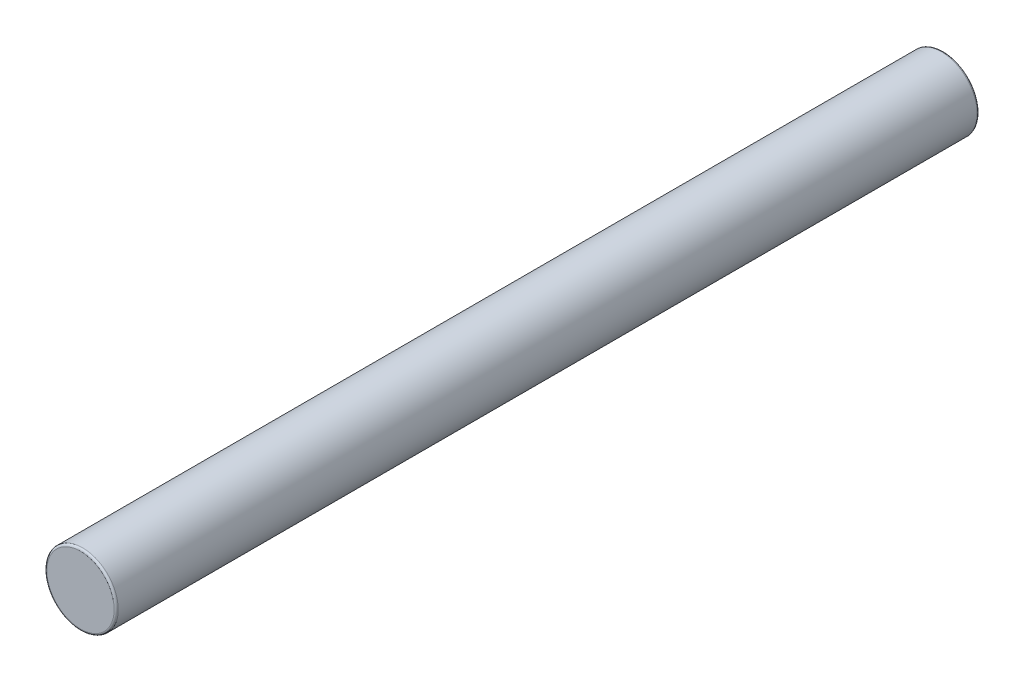
ISO-10303-21;
HEADER;
FILE_DESCRIPTION(('STEP AP214'),'2;1');
FILE_NAME('part.step','',(''),(''),'','','');
FILE_SCHEMA(('AUTOMOTIVE_DESIGN { 1 0 10303 214 1 1 1 1 }'));
ENDSEC;
DATA;
#1=APPLICATION_CONTEXT('core data for automotive mechanical design processes');
#2=APPLICATION_PROTOCOL_DEFINITION('international standard','automotive_design',2000,#1);
#3=PRODUCT_CONTEXT('',#1,'mechanical');
#4=PRODUCT('Part','Part','',(#3));
#5=PRODUCT_RELATED_PRODUCT_CATEGORY('part','',(#4));
#6=PRODUCT_DEFINITION_FORMATION('','',#4);
#7=PRODUCT_DEFINITION_CONTEXT('part definition',#1,'design');
#8=PRODUCT_DEFINITION('design','',#6,#7);
#9=PRODUCT_DEFINITION_SHAPE('','',#8);
#10=(LENGTH_UNIT() NAMED_UNIT(*) SI_UNIT(.MILLI.,.METRE.));
#11=(NAMED_UNIT(*) PLANE_ANGLE_UNIT() SI_UNIT($,.RADIAN.));
#12=(NAMED_UNIT(*) SI_UNIT($,.STERADIAN.) SOLID_ANGLE_UNIT());
#13=UNCERTAINTY_MEASURE_WITH_UNIT(LENGTH_MEASURE(1.E-05),#10,'distance_accuracy_value','');
#14=(GEOMETRIC_REPRESENTATION_CONTEXT(3) GLOBAL_UNCERTAINTY_ASSIGNED_CONTEXT((#13)) GLOBAL_UNIT_ASSIGNED_CONTEXT((#10,
#11,#12)) REPRESENTATION_CONTEXT('',''));
#15=CARTESIAN_POINT('',(0.,0.,0.));
#16=DIRECTION('',(0.,0.,1.));
#17=DIRECTION('',(1.,0.,0.));
#18=AXIS2_PLACEMENT_3D('',#15,#16,#17);
#19=CARTESIAN_POINT('',(0.,0.,42.));
#20=DIRECTION('',(0.,0.,-1.));
#21=DIRECTION('',(-1.,0.,0.));
#22=AXIS2_PLACEMENT_3D('',#19,#20,#21);
#23=CYLINDRICAL_SURFACE('',#22,3.475);
#24=CARTESIAN_POINT('',(0.,0.,41.8));
#25=DIRECTION('',(0.,0.,1.));
#26=DIRECTION('',(1.,0.,0.));
#27=AXIS2_PLACEMENT_3D('',#24,#25,#26);
#28=CIRCLE('',#27,3.475);
#29=CARTESIAN_POINT('',(-3.475,0.,41.8));
#30=VERTEX_POINT('',#29);
#31=EDGE_CURVE('E49',#30,#30,#28,.F.);
#32=CARTESIAN_POINT('',(0.,0.,-41.8));
#33=DIRECTION('',(0.,0.,1.));
#34=DIRECTION('',(1.,0.,0.));
#35=AXIS2_PLACEMENT_3D('',#32,#33,#34);
#36=CIRCLE('',#35,3.475);
#37=CARTESIAN_POINT('',(-3.475,0.,-41.8));
#38=VERTEX_POINT('',#37);
#39=EDGE_CURVE('E54',#38,#38,#36,.T.);
#40=CARTESIAN_POINT('',(-3.475,0.,41.8));
#41=CARTESIAN_POINT('',(-3.475,0.,40.9291666666667));
#42=CARTESIAN_POINT('',(-3.475,0.,40.0583333333333));
#43=CARTESIAN_POINT('',(-3.475,0.,38.3166666666667));
#44=CARTESIAN_POINT('',(-3.475,0.,37.4458333333333));
#45=CARTESIAN_POINT('',(-3.475,0.,35.7041666666667));
#46=CARTESIAN_POINT('',(-3.475,0.,34.8333333333333));
#47=CARTESIAN_POINT('',(-3.475,0.,33.0916666666667));
#48=CARTESIAN_POINT('',(-3.475,0.,32.2208333333333));
#49=CARTESIAN_POINT('',(-3.475,0.,30.4791666666667));
#50=CARTESIAN_POINT('',(-3.475,0.,29.6083333333333));
#51=CARTESIAN_POINT('',(-3.475,0.,27.8666666666667));
#52=CARTESIAN_POINT('',(-3.475,0.,26.9958333333333));
#53=CARTESIAN_POINT('',(-3.475,0.,25.2541666666667));
#54=CARTESIAN_POINT('',(-3.475,0.,24.3833333333333));
#55=CARTESIAN_POINT('',(-3.475,0.,22.6416666666667));
#56=CARTESIAN_POINT('',(-3.475,0.,21.7708333333333));
#57=CARTESIAN_POINT('',(-3.475,0.,20.0291666666667));
#58=CARTESIAN_POINT('',(-3.475,0.,19.1583333333333));
#59=CARTESIAN_POINT('',(-3.475,0.,17.4166666666667));
#60=CARTESIAN_POINT('',(-3.475,0.,16.5458333333333));
#61=CARTESIAN_POINT('',(-3.475,0.,14.8041666666667));
#62=CARTESIAN_POINT('',(-3.475,0.,13.9333333333333));
#63=CARTESIAN_POINT('',(-3.475,0.,12.1916666666667));
#64=CARTESIAN_POINT('',(-3.475,0.,11.3208333333333));
#65=CARTESIAN_POINT('',(-3.475,0.,9.57916666666666));
#66=CARTESIAN_POINT('',(-3.475,0.,8.70833333333332));
#67=CARTESIAN_POINT('',(-3.475,0.,6.96666666666666));
#68=CARTESIAN_POINT('',(-3.475,0.,6.09583333333332));
#69=CARTESIAN_POINT('',(-3.475,0.,4.35416666666665));
#70=CARTESIAN_POINT('',(-3.475,0.,3.48333333333332));
#71=CARTESIAN_POINT('',(-3.475,0.,1.74166666666666));
#72=CARTESIAN_POINT('',(-3.475,0.,0.870833333333321));
#73=CARTESIAN_POINT('',(-3.475,0.,-0.870833333333348));
#74=CARTESIAN_POINT('',(-3.475,0.,-1.74166666666668));
#75=CARTESIAN_POINT('',(-3.475,0.,-3.48333333333335));
#76=CARTESIAN_POINT('',(-3.475,0.,-4.35416666666668));
#77=CARTESIAN_POINT('',(-3.475,0.,-6.09583333333335));
#78=CARTESIAN_POINT('',(-3.475,0.,-6.96666666666668));
#79=CARTESIAN_POINT('',(-3.475,0.,-8.70833333333335));
#80=CARTESIAN_POINT('',(-3.475,0.,-9.57916666666668));
#81=CARTESIAN_POINT('',(-3.475,0.,-11.3208333333333));
#82=CARTESIAN_POINT('',(-3.475,0.,-12.1916666666667));
#83=CARTESIAN_POINT('',(-3.475,0.,-13.9333333333334));
#84=CARTESIAN_POINT('',(-3.475,0.,-14.8041666666667));
#85=CARTESIAN_POINT('',(-3.475,0.,-16.5458333333334));
#86=CARTESIAN_POINT('',(-3.475,0.,-17.4166666666667));
#87=CARTESIAN_POINT('',(-3.475,0.,-19.1583333333334));
#88=CARTESIAN_POINT('',(-3.475,0.,-20.0291666666667));
#89=CARTESIAN_POINT('',(-3.475,0.,-21.7708333333334));
#90=CARTESIAN_POINT('',(-3.475,0.,-22.6416666666667));
#91=CARTESIAN_POINT('',(-3.475,0.,-24.3833333333333));
#92=CARTESIAN_POINT('',(-3.475,0.,-25.2541666666667));
#93=CARTESIAN_POINT('',(-3.475,0.,-26.9958333333334));
#94=CARTESIAN_POINT('',(-3.475,0.,-27.8666666666667));
#95=CARTESIAN_POINT('',(-3.475,0.,-29.6083333333334));
#96=CARTESIAN_POINT('',(-3.475,0.,-30.4791666666667));
#97=CARTESIAN_POINT('',(-3.475,0.,-32.2208333333334));
#98=CARTESIAN_POINT('',(-3.475,0.,-33.0916666666667));
#99=CARTESIAN_POINT('',(-3.475,0.,-34.8333333333334));
#100=CARTESIAN_POINT('',(-3.475,0.,-35.7041666666667));
#101=CARTESIAN_POINT('',(-3.475,0.,-37.4458333333334));
#102=CARTESIAN_POINT('',(-3.475,0.,-38.3166666666667));
#103=CARTESIAN_POINT('',(-3.475,0.,-40.0583333333334));
#104=CARTESIAN_POINT('',(-3.475,0.,-40.9291666666667));
#105=CARTESIAN_POINT('',(-3.475,0.,-41.8));
#106=B_SPLINE_CURVE_WITH_KNOTS('',3,(#40,#41,#42,#43,#44,#45,#46,#47,#48,#49,#50,#51,#52,#53,
#54,#55,#56,#57,#58,#59,#60,#61,#62,#63,#64,#65,#66,#67,#68,#69,#70,#71,#72,#73,#74,#75,#76,#77,
#78,#79,#80,#81,#82,#83,#84,#85,#86,#87,#88,#89,#90,#91,#92,#93,#94,#95,#96,#97,#98,#99,#100,
#101,#102,#103,#104,#105),.UNSPECIFIED.,.F.,.F.,(4,2,2,2,2,2,2,2,2,2,2,2,2,2,2,2,2,2,2,2,2,2,2,
2,2,2,2,2,2,2,2,2,4),(0.,2.6125,5.225,7.8375,10.45,13.0625,15.675,18.2875,20.9,23.5125,26.125,
28.7375,31.35,33.9625,36.575,39.1875,41.8,44.4125,47.025,49.6375,52.25,54.8625,57.475,60.0875,
62.7,65.3125,67.925,70.5375,73.15,75.7625,78.375,80.9875,83.6),.UNSPECIFIED.);
#107=EDGE_CURVE('BSEAM41',#30,#38,#106,.T.);
#108=ORIENTED_EDGE('',*,*,#31,.T.);
#109=ORIENTED_EDGE('',*,*,#39,.T.);
#110=ORIENTED_EDGE('',*,*,#107,.T.);
#111=ORIENTED_EDGE('',*,*,#107,.F.);
#112=EDGE_LOOP('',(#108,#110,#109,#111));
#113=FACE_BOUND('',#112,.T.);
#114=ADVANCED_FACE('F41',(#113),#23,.T.);
#115=CARTESIAN_POINT('',(0.,0.,42.));
#116=DIRECTION('',(0.,0.,1.));
#117=DIRECTION('',(1.,0.,0.));
#118=AXIS2_PLACEMENT_3D('',#115,#116,#117);
#119=PLANE('',#118);
#120=CARTESIAN_POINT('',(0.,0.,42.));
#121=DIRECTION('',(0.,0.,1.));
#122=DIRECTION('',(1.,0.,0.));
#123=AXIS2_PLACEMENT_3D('',#120,#121,#122);
#124=CIRCLE('',#123,3.275);
#125=CARTESIAN_POINT('',(3.275,0.,42.));
#126=VERTEX_POINT('',#125);
#127=EDGE_CURVE('E59',#126,#126,#124,.T.);
#128=ORIENTED_EDGE('',*,*,#127,.T.);
#129=EDGE_LOOP('',(#128));
#130=FACE_BOUND('',#129,.T.);
#131=ADVANCED_FACE('F66',(#130),#119,.T.);
#132=CARTESIAN_POINT('',(0.,0.,-42.));
#133=DIRECTION('',(0.,0.,1.));
#134=DIRECTION('',(1.,0.,0.));
#135=AXIS2_PLACEMENT_3D('',#132,#133,#134);
#136=PLANE('',#135);
#137=CARTESIAN_POINT('',(0.,0.,-42.));
#138=DIRECTION('',(0.,0.,1.));
#139=DIRECTION('',(1.,0.,0.));
#140=AXIS2_PLACEMENT_3D('',#137,#138,#139);
#141=CIRCLE('',#140,3.275);
#142=CARTESIAN_POINT('',(3.275,0.,-42.));
#143=VERTEX_POINT('',#142);
#144=EDGE_CURVE('E10',#143,#143,#141,.F.);
#145=ORIENTED_EDGE('',*,*,#144,.T.);
#146=EDGE_LOOP('',(#145));
#147=FACE_BOUND('',#146,.T.);
#148=ADVANCED_FACE('F70',(#147),#136,.F.);
#149=CARTESIAN_POINT('',(0.,0.,41.8));
#150=DIRECTION('',(0.,0.,1.));
#151=DIRECTION('',(1.,0.,0.));
#152=AXIS2_PLACEMENT_3D('',#149,#150,#151);
#153=TOROIDAL_SURFACE('',#152,3.275,0.2);
#154=ORIENTED_EDGE('',*,*,#31,.F.);
#155=EDGE_LOOP('',(#154));
#156=FACE_BOUND('',#155,.T.);
#157=ORIENTED_EDGE('',*,*,#127,.F.);
#158=EDGE_LOOP('',(#157));
#159=FACE_BOUND('',#158,.T.);
#160=ADVANCED_FACE('F68',(#156,#159),#153,.T.);
#161=CARTESIAN_POINT('',(0.,0.,-41.8));
#162=DIRECTION('',(0.,0.,1.));
#163=DIRECTION('',(1.,0.,0.));
#164=AXIS2_PLACEMENT_3D('',#161,#162,#163);
#165=TOROIDAL_SURFACE('',#164,3.275,0.2);
#166=ORIENTED_EDGE('',*,*,#144,.F.);
#167=EDGE_LOOP('',(#166));
#168=FACE_BOUND('',#167,.T.);
#169=ORIENTED_EDGE('',*,*,#39,.F.);
#170=EDGE_LOOP('',(#169));
#171=FACE_BOUND('',#170,.T.);
#172=ADVANCED_FACE('F43',(#168,#171),#165,.T.);
#173=CLOSED_SHELL('',(#114,#131,#148,#160,#172));
#174=MANIFOLD_SOLID_BREP('B2',#173);
#175=ADVANCED_BREP_SHAPE_REPRESENTATION('',(#18,#174),#14);
#176=SHAPE_DEFINITION_REPRESENTATION(#9,#175);
ENDSEC;
END-ISO-10303-21;
